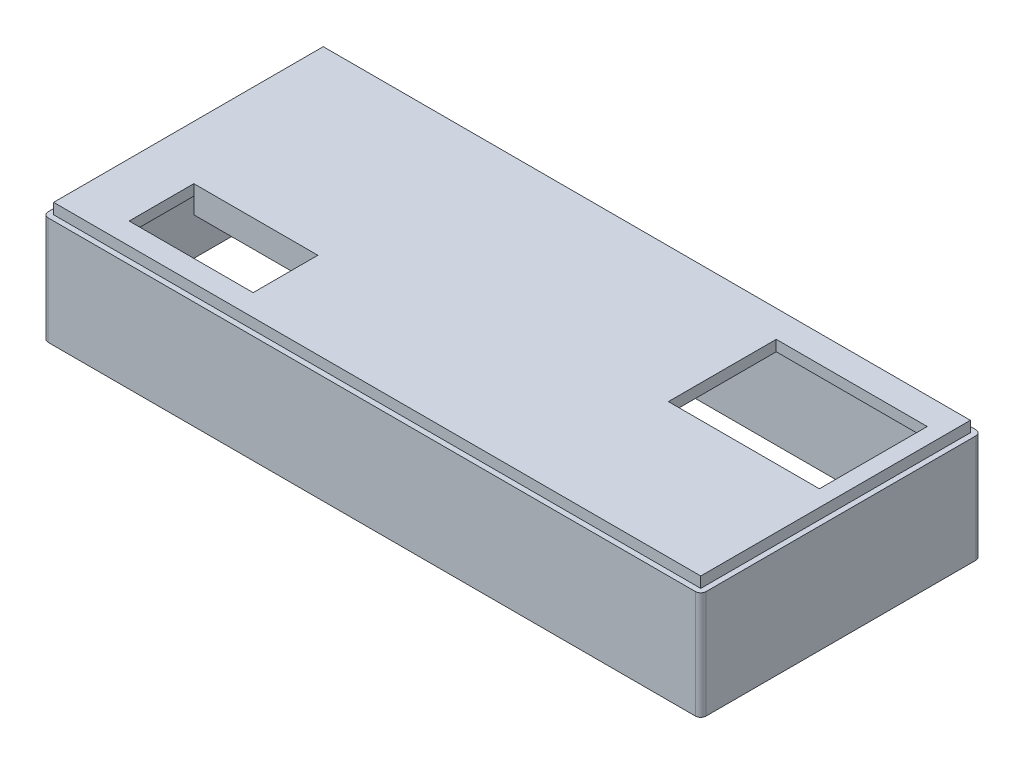
ISO-10303-21;
HEADER;
FILE_DESCRIPTION(('STEP AP214'),'2;1');
FILE_NAME('part.step','',(''),(''),'','','');
FILE_SCHEMA(('AUTOMOTIVE_DESIGN { 1 0 10303 214 1 1 1 1 }'));
ENDSEC;
DATA;
#1=APPLICATION_CONTEXT('core data for automotive mechanical design processes');
#2=APPLICATION_PROTOCOL_DEFINITION('international standard','automotive_design',2000,#1);
#3=PRODUCT_CONTEXT('',#1,'mechanical');
#4=PRODUCT('Part','Part','',(#3));
#5=PRODUCT_RELATED_PRODUCT_CATEGORY('part','',(#4));
#6=PRODUCT_DEFINITION_FORMATION('','',#4);
#7=PRODUCT_DEFINITION_CONTEXT('part definition',#1,'design');
#8=PRODUCT_DEFINITION('design','',#6,#7);
#9=PRODUCT_DEFINITION_SHAPE('','',#8);
#10=(LENGTH_UNIT() NAMED_UNIT(*) SI_UNIT(.MILLI.,.METRE.));
#11=(NAMED_UNIT(*) PLANE_ANGLE_UNIT() SI_UNIT($,.RADIAN.));
#12=(NAMED_UNIT(*) SI_UNIT($,.STERADIAN.) SOLID_ANGLE_UNIT());
#13=UNCERTAINTY_MEASURE_WITH_UNIT(LENGTH_MEASURE(1.E-05),#10,'distance_accuracy_value','');
#14=(GEOMETRIC_REPRESENTATION_CONTEXT(3) GLOBAL_UNCERTAINTY_ASSIGNED_CONTEXT((#13)) GLOBAL_UNIT_ASSIGNED_CONTEXT((#10,
#11,#12)) REPRESENTATION_CONTEXT('',''));
#15=CARTESIAN_POINT('',(0.,0.,0.));
#16=DIRECTION('',(0.,0.,1.));
#17=DIRECTION('',(1.,0.,0.));
#18=AXIS2_PLACEMENT_3D('',#15,#16,#17);
#19=CARTESIAN_POINT('',(0.,-20.,0.));
#20=DIRECTION('',(0.,-1.,0.));
#21=DIRECTION('',(0.,0.,-1.));
#22=AXIS2_PLACEMENT_3D('',#19,#20,#21);
#23=PLANE('',#22);
#24=DIRECTION('',(0.,0.,1.));
#25=VECTOR('',#24,1.);
#26=CARTESIAN_POINT('',(121.,-20.,0.));
#27=LINE('',#26,#25);
#28=CARTESIAN_POINT('',(121.,-20.,0.));
#29=VERTEX_POINT('',#28);
#30=CARTESIAN_POINT('',(121.,-20.,50.));
#31=VERTEX_POINT('',#30);
#32=EDGE_CURVE('E299',#29,#31,#27,.T.);
#33=ORIENTED_EDGE('',*,*,#32,.T.);
#34=CARTESIAN_POINT('',(120.,-20.,50.));
#35=DIRECTION('',(0.,-1.,0.));
#36=DIRECTION('',(0.,0.,-1.));
#37=AXIS2_PLACEMENT_3D('',#34,#35,#36);
#38=CIRCLE('',#37,1.);
#39=CARTESIAN_POINT('',(120.,-20.,51.));
#40=VERTEX_POINT('',#39);
#41=EDGE_CURVE('E243',#31,#40,#38,.T.);
#42=ORIENTED_EDGE('',*,*,#41,.T.);
#43=DIRECTION('',(-1.,0.,0.));
#44=VECTOR('',#43,1.);
#45=CARTESIAN_POINT('',(120.,-20.,51.));
#46=LINE('',#45,#44);
#47=CARTESIAN_POINT('',(0.,-20.,51.));
#48=VERTEX_POINT('',#47);
#49=EDGE_CURVE('E302',#40,#48,#46,.T.);
#50=ORIENTED_EDGE('',*,*,#49,.T.);
#51=CARTESIAN_POINT('',(0.,-20.,50.));
#52=DIRECTION('',(0.,-1.,0.));
#53=DIRECTION('',(0.,0.,-1.));
#54=AXIS2_PLACEMENT_3D('',#51,#52,#53);
#55=CIRCLE('',#54,1.);
#56=CARTESIAN_POINT('',(-0.999999999999994,-20.,50.));
#57=VERTEX_POINT('',#56);
#58=EDGE_CURVE('E241',#48,#57,#55,.T.);
#59=ORIENTED_EDGE('',*,*,#58,.T.);
#60=DIRECTION('',(0.,0.,-1.));
#61=VECTOR('',#60,1.);
#62=CARTESIAN_POINT('',(-0.999999999999994,-20.,50.));
#63=LINE('',#62,#61);
#64=CARTESIAN_POINT('',(-1.,-20.,0.));
#65=VERTEX_POINT('',#64);
#66=EDGE_CURVE('E209',#57,#65,#63,.T.);
#67=ORIENTED_EDGE('',*,*,#66,.T.);
#68=CARTESIAN_POINT('',(0.,-20.,0.));
#69=DIRECTION('',(0.,-1.,0.));
#70=DIRECTION('',(0.,0.,-1.));
#71=AXIS2_PLACEMENT_3D('',#68,#69,#70);
#72=CIRCLE('',#71,1.);
#73=CARTESIAN_POINT('',(0.,-20.,-1.));
#74=VERTEX_POINT('',#73);
#75=EDGE_CURVE('E239',#65,#74,#72,.T.);
#76=ORIENTED_EDGE('',*,*,#75,.T.);
#77=DIRECTION('',(1.,0.,0.));
#78=VECTOR('',#77,1.);
#79=CARTESIAN_POINT('',(0.,-20.,-1.));
#80=LINE('',#79,#78);
#81=CARTESIAN_POINT('',(120.,-20.,-1.));
#82=VERTEX_POINT('',#81);
#83=EDGE_CURVE('E204',#74,#82,#80,.T.);
#84=ORIENTED_EDGE('',*,*,#83,.T.);
#85=CARTESIAN_POINT('',(120.,-20.,0.));
#86=DIRECTION('',(0.,-1.,0.));
#87=DIRECTION('',(0.,0.,-1.));
#88=AXIS2_PLACEMENT_3D('',#85,#86,#87);
#89=CIRCLE('',#88,1.);
#90=EDGE_CURVE('E237',#82,#29,#89,.T.);
#91=ORIENTED_EDGE('',*,*,#90,.T.);
#92=EDGE_LOOP('',(#33,#42,#50,#59,#67,#76,#84,#91));
#93=FACE_BOUND('',#92,.T.);
#94=DIRECTION('',(-1.,0.,0.));
#95=VECTOR('',#94,1.);
#96=CARTESIAN_POINT('',(120.,-20.,50.));
#97=LINE('',#96,#95);
#98=CARTESIAN_POINT('',(119.,-20.,50.));
#99=VERTEX_POINT('',#98);
#100=CARTESIAN_POINT('',(1.,-20.,50.));
#101=VERTEX_POINT('',#100);
#102=EDGE_CURVE('E288',#99,#101,#97,.T.);
#103=ORIENTED_EDGE('',*,*,#102,.F.);
#104=CARTESIAN_POINT('',(119.,-20.,49.));
#105=DIRECTION('',(0.,-1.,0.));
#106=DIRECTION('',(0.,0.,-1.));
#107=AXIS2_PLACEMENT_3D('',#104,#105,#106);
#108=CIRCLE('',#107,1.);
#109=CARTESIAN_POINT('',(120.,-20.,49.));
#110=VERTEX_POINT('',#109);
#111=EDGE_CURVE('E265',#99,#110,#108,.F.);
#112=ORIENTED_EDGE('',*,*,#111,.T.);
#113=DIRECTION('',(0.,0.,1.));
#114=VECTOR('',#113,1.);
#115=CARTESIAN_POINT('',(120.,-20.,0.));
#116=LINE('',#115,#114);
#117=CARTESIAN_POINT('',(120.,-20.,1.));
#118=VERTEX_POINT('',#117);
#119=EDGE_CURVE('E281',#118,#110,#116,.T.);
#120=ORIENTED_EDGE('',*,*,#119,.F.);
#121=CARTESIAN_POINT('',(119.,-20.,1.));
#122=DIRECTION('',(0.,-1.,0.));
#123=DIRECTION('',(0.,0.,-1.));
#124=AXIS2_PLACEMENT_3D('',#121,#122,#123);
#125=CIRCLE('',#124,1.);
#126=CARTESIAN_POINT('',(119.,-20.,0.));
#127=VERTEX_POINT('',#126);
#128=EDGE_CURVE('E13',#118,#127,#125,.F.);
#129=ORIENTED_EDGE('',*,*,#128,.T.);
#130=DIRECTION('',(1.,0.,0.));
#131=VECTOR('',#130,1.);
#132=CARTESIAN_POINT('',(0.,-20.,0.));
#133=LINE('',#132,#131);
#134=CARTESIAN_POINT('',(1.,-20.,0.));
#135=VERTEX_POINT('',#134);
#136=EDGE_CURVE('E287',#135,#127,#133,.T.);
#137=ORIENTED_EDGE('',*,*,#136,.F.);
#138=CARTESIAN_POINT('',(1.,-20.,1.));
#139=DIRECTION('',(0.,-1.,0.));
#140=DIRECTION('',(0.,0.,-1.));
#141=AXIS2_PLACEMENT_3D('',#138,#139,#140);
#142=CIRCLE('',#141,1.);
#143=CARTESIAN_POINT('',(0.,-20.,1.));
#144=VERTEX_POINT('',#143);
#145=EDGE_CURVE('E84',#135,#144,#142,.F.);
#146=ORIENTED_EDGE('',*,*,#145,.T.);
#147=DIRECTION('',(0.,0.,-1.));
#148=VECTOR('',#147,1.);
#149=CARTESIAN_POINT('',(0.,-20.,50.));
#150=LINE('',#149,#148);
#151=CARTESIAN_POINT('',(0.,-20.,49.));
#152=VERTEX_POINT('',#151);
#153=EDGE_CURVE('E285',#152,#144,#150,.T.);
#154=ORIENTED_EDGE('',*,*,#153,.F.);
#155=CARTESIAN_POINT('',(1.,-20.,49.));
#156=DIRECTION('',(0.,-1.,0.));
#157=DIRECTION('',(0.,0.,-1.));
#158=AXIS2_PLACEMENT_3D('',#155,#156,#157);
#159=CIRCLE('',#158,1.);
#160=EDGE_CURVE('E269',#152,#101,#159,.F.);
#161=ORIENTED_EDGE('',*,*,#160,.T.);
#162=EDGE_LOOP('',(#103,#112,#120,#129,#137,#146,#154,#161));
#163=FACE_BOUND('',#162,.T.);
#164=ADVANCED_FACE('F69',(#93,#163),#23,.T.);
#165=CARTESIAN_POINT('',(0.,0.,0.));
#166=DIRECTION('',(0.,-1.,0.));
#167=DIRECTION('',(0.,0.,-1.));
#168=AXIS2_PLACEMENT_3D('',#165,#166,#167);
#169=PLANE('',#168);
#170=DIRECTION('',(-1.,0.,0.));
#171=VECTOR('',#170,1.);
#172=CARTESIAN_POINT('',(120.,0.,51.));
#173=LINE('',#172,#171);
#174=CARTESIAN_POINT('',(120.,0.,51.));
#175=VERTEX_POINT('',#174);
#176=CARTESIAN_POINT('',(0.,0.,51.));
#177=VERTEX_POINT('',#176);
#178=EDGE_CURVE('E309',#175,#177,#173,.T.);
#179=ORIENTED_EDGE('',*,*,#178,.F.);
#180=CARTESIAN_POINT('',(120.,0.,50.));
#181=DIRECTION('',(0.,-1.,0.));
#182=DIRECTION('',(0.,0.,-1.));
#183=AXIS2_PLACEMENT_3D('',#180,#181,#182);
#184=CIRCLE('',#183,1.);
#185=CARTESIAN_POINT('',(121.,0.,50.));
#186=VERTEX_POINT('',#185);
#187=EDGE_CURVE('E230',#175,#186,#184,.F.);
#188=ORIENTED_EDGE('',*,*,#187,.T.);
#189=DIRECTION('',(0.,0.,1.));
#190=VECTOR('',#189,1.);
#191=CARTESIAN_POINT('',(121.,0.,0.));
#192=LINE('',#191,#190);
#193=CARTESIAN_POINT('',(121.,0.,0.));
#194=VERTEX_POINT('',#193);
#195=EDGE_CURVE('E290',#194,#186,#192,.T.);
#196=ORIENTED_EDGE('',*,*,#195,.F.);
#197=CARTESIAN_POINT('',(120.,0.,0.));
#198=DIRECTION('',(0.,-1.,0.));
#199=DIRECTION('',(0.,0.,-1.));
#200=AXIS2_PLACEMENT_3D('',#197,#198,#199);
#201=CIRCLE('',#200,1.);
#202=CARTESIAN_POINT('',(120.,0.,-1.));
#203=VERTEX_POINT('',#202);
#204=EDGE_CURVE('E224',#194,#203,#201,.F.);
#205=ORIENTED_EDGE('',*,*,#204,.T.);
#206=DIRECTION('',(1.,0.,0.));
#207=VECTOR('',#206,1.);
#208=CARTESIAN_POINT('',(0.,0.,-1.));
#209=LINE('',#208,#207);
#210=CARTESIAN_POINT('',(0.,0.,-1.));
#211=VERTEX_POINT('',#210);
#212=EDGE_CURVE('E212',#211,#203,#209,.T.);
#213=ORIENTED_EDGE('',*,*,#212,.F.);
#214=CARTESIAN_POINT('',(0.,0.,0.));
#215=DIRECTION('',(0.,-1.,0.));
#216=DIRECTION('',(0.,0.,-1.));
#217=AXIS2_PLACEMENT_3D('',#214,#215,#216);
#218=CIRCLE('',#217,1.);
#219=CARTESIAN_POINT('',(-1.,0.,0.));
#220=VERTEX_POINT('',#219);
#221=EDGE_CURVE('E226',#211,#220,#218,.F.);
#222=ORIENTED_EDGE('',*,*,#221,.T.);
#223=DIRECTION('',(0.,0.,-1.));
#224=VECTOR('',#223,1.);
#225=CARTESIAN_POINT('',(-0.999999999999994,0.,50.));
#226=LINE('',#225,#224);
#227=CARTESIAN_POINT('',(-0.999999999999994,0.,50.));
#228=VERTEX_POINT('',#227);
#229=EDGE_CURVE('E311',#228,#220,#226,.T.);
#230=ORIENTED_EDGE('',*,*,#229,.F.);
#231=CARTESIAN_POINT('',(0.,0.,50.));
#232=DIRECTION('',(0.,-1.,0.));
#233=DIRECTION('',(0.,0.,-1.));
#234=AXIS2_PLACEMENT_3D('',#231,#232,#233);
#235=CIRCLE('',#234,1.);
#236=EDGE_CURVE('E228',#228,#177,#235,.F.);
#237=ORIENTED_EDGE('',*,*,#236,.T.);
#238=EDGE_LOOP('',(#179,#188,#196,#205,#213,#222,#230,#237));
#239=FACE_BOUND('',#238,.T.);
#240=DIRECTION('',(1.,0.,0.));
#241=VECTOR('',#240,1.);
#242=CARTESIAN_POINT('',(0.,0.,0.));
#243=LINE('',#242,#241);
#244=CARTESIAN_POINT('',(1.,0.,0.));
#245=VERTEX_POINT('',#244);
#246=CARTESIAN_POINT('',(119.,0.,0.));
#247=VERTEX_POINT('',#246);
#248=EDGE_CURVE('E187',#245,#247,#243,.T.);
#249=ORIENTED_EDGE('',*,*,#248,.T.);
#250=CARTESIAN_POINT('',(119.,0.,1.));
#251=DIRECTION('',(0.,-1.,0.));
#252=DIRECTION('',(0.,0.,-1.));
#253=AXIS2_PLACEMENT_3D('',#250,#251,#252);
#254=CIRCLE('',#253,1.);
#255=CARTESIAN_POINT('',(120.,0.,1.));
#256=VERTEX_POINT('',#255);
#257=EDGE_CURVE('E77',#247,#256,#254,.T.);
#258=ORIENTED_EDGE('',*,*,#257,.T.);
#259=DIRECTION('',(0.,0.,1.));
#260=VECTOR('',#259,1.);
#261=CARTESIAN_POINT('',(120.,0.,0.));
#262=LINE('',#261,#260);
#263=CARTESIAN_POINT('',(120.,0.,49.));
#264=VERTEX_POINT('',#263);
#265=EDGE_CURVE('E185',#256,#264,#262,.T.);
#266=ORIENTED_EDGE('',*,*,#265,.T.);
#267=CARTESIAN_POINT('',(119.,0.,49.));
#268=DIRECTION('',(0.,-1.,0.));
#269=DIRECTION('',(0.,0.,-1.));
#270=AXIS2_PLACEMENT_3D('',#267,#268,#269);
#271=CIRCLE('',#270,1.);
#272=CARTESIAN_POINT('',(119.,0.,50.));
#273=VERTEX_POINT('',#272);
#274=EDGE_CURVE('E263',#264,#273,#271,.T.);
#275=ORIENTED_EDGE('',*,*,#274,.T.);
#276=DIRECTION('',(-1.,0.,0.));
#277=VECTOR('',#276,1.);
#278=CARTESIAN_POINT('',(120.,0.,50.));
#279=LINE('',#278,#277);
#280=CARTESIAN_POINT('',(1.,0.,50.));
#281=VERTEX_POINT('',#280);
#282=EDGE_CURVE('E200',#273,#281,#279,.T.);
#283=ORIENTED_EDGE('',*,*,#282,.T.);
#284=CARTESIAN_POINT('',(1.,0.,49.));
#285=DIRECTION('',(0.,-1.,0.));
#286=DIRECTION('',(0.,0.,-1.));
#287=AXIS2_PLACEMENT_3D('',#284,#285,#286);
#288=CIRCLE('',#287,1.);
#289=CARTESIAN_POINT('',(0.,0.,49.));
#290=VERTEX_POINT('',#289);
#291=EDGE_CURVE('E267',#281,#290,#288,.T.);
#292=ORIENTED_EDGE('',*,*,#291,.T.);
#293=DIRECTION('',(0.,0.,-1.));
#294=VECTOR('',#293,1.);
#295=CARTESIAN_POINT('',(0.,0.,50.));
#296=LINE('',#295,#294);
#297=CARTESIAN_POINT('',(0.,0.,1.));
#298=VERTEX_POINT('',#297);
#299=EDGE_CURVE('E274',#290,#298,#296,.T.);
#300=ORIENTED_EDGE('',*,*,#299,.T.);
#301=CARTESIAN_POINT('',(1.,0.,1.));
#302=DIRECTION('',(0.,-1.,0.));
#303=DIRECTION('',(0.,0.,-1.));
#304=AXIS2_PLACEMENT_3D('',#301,#302,#303);
#305=CIRCLE('',#304,1.);
#306=EDGE_CURVE('E271',#298,#245,#305,.T.);
#307=ORIENTED_EDGE('',*,*,#306,.T.);
#308=EDGE_LOOP('',(#249,#258,#266,#275,#283,#292,#300,#307));
#309=FACE_BOUND('',#308,.T.);
#310=ADVANCED_FACE('F184',(#239,#309),#169,.F.);
#311=CARTESIAN_POINT('',(121.,-20.,0.));
#312=DIRECTION('',(-1.,0.,0.));
#313=DIRECTION('',(0.,0.,1.));
#314=AXIS2_PLACEMENT_3D('',#311,#312,#313);
#315=PLANE('',#314);
#316=ORIENTED_EDGE('',*,*,#195,.T.);
#317=DIRECTION('',(0.,1.,0.));
#318=VECTOR('',#317,1.);
#319=CARTESIAN_POINT('',(121.,-20.,50.));
#320=LINE('',#319,#318);
#321=EDGE_CURVE('E235',#186,#31,#320,.F.);
#322=ORIENTED_EDGE('',*,*,#321,.T.);
#323=ORIENTED_EDGE('',*,*,#32,.F.);
#324=DIRECTION('',(0.,1.,0.));
#325=VECTOR('',#324,1.);
#326=CARTESIAN_POINT('',(121.,-20.,0.));
#327=LINE('',#326,#325);
#328=EDGE_CURVE('E232',#29,#194,#327,.T.);
#329=ORIENTED_EDGE('',*,*,#328,.T.);
#330=EDGE_LOOP('',(#316,#322,#323,#329));
#331=FACE_BOUND('',#330,.T.);
#332=ADVANCED_FACE('F331',(#331),#315,.F.);
#333=CARTESIAN_POINT('',(120.,-20.,51.));
#334=DIRECTION('',(0.,0.,-1.));
#335=DIRECTION('',(-1.,0.,0.));
#336=AXIS2_PLACEMENT_3D('',#333,#334,#335);
#337=PLANE('',#336);
#338=ORIENTED_EDGE('',*,*,#49,.F.);
#339=DIRECTION('',(0.,1.,0.));
#340=VECTOR('',#339,1.);
#341=CARTESIAN_POINT('',(120.,-20.,51.));
#342=LINE('',#341,#340);
#343=EDGE_CURVE('E221',#40,#175,#342,.T.);
#344=ORIENTED_EDGE('',*,*,#343,.T.);
#345=ORIENTED_EDGE('',*,*,#178,.T.);
#346=DIRECTION('',(0.,1.,0.));
#347=VECTOR('',#346,1.);
#348=CARTESIAN_POINT('',(0.,-20.,51.));
#349=LINE('',#348,#347);
#350=EDGE_CURVE('E219',#177,#48,#349,.F.);
#351=ORIENTED_EDGE('',*,*,#350,.T.);
#352=EDGE_LOOP('',(#338,#344,#345,#351));
#353=FACE_BOUND('',#352,.T.);
#354=ADVANCED_FACE('F340',(#353),#337,.F.);
#355=CARTESIAN_POINT('',(-0.999999999999994,-20.,50.));
#356=DIRECTION('',(1.,0.,0.));
#357=DIRECTION('',(0.,0.,-1.));
#358=AXIS2_PLACEMENT_3D('',#355,#356,#357);
#359=PLANE('',#358);
#360=ORIENTED_EDGE('',*,*,#66,.F.);
#361=DIRECTION('',(0.,1.,0.));
#362=VECTOR('',#361,1.);
#363=CARTESIAN_POINT('',(-0.999999999999994,-20.,50.));
#364=LINE('',#363,#362);
#365=EDGE_CURVE('E247',#57,#228,#364,.T.);
#366=ORIENTED_EDGE('',*,*,#365,.T.);
#367=ORIENTED_EDGE('',*,*,#229,.T.);
#368=DIRECTION('',(0.,1.,0.));
#369=VECTOR('',#368,1.);
#370=CARTESIAN_POINT('',(-1.,-20.,0.));
#371=LINE('',#370,#369);
#372=EDGE_CURVE('E245',#220,#65,#371,.F.);
#373=ORIENTED_EDGE('',*,*,#372,.T.);
#374=EDGE_LOOP('',(#360,#366,#367,#373));
#375=FACE_BOUND('',#374,.T.);
#376=ADVANCED_FACE('F348',(#375),#359,.F.);
#377=CARTESIAN_POINT('',(0.,-20.,-1.));
#378=DIRECTION('',(0.,0.,1.));
#379=DIRECTION('',(1.,0.,0.));
#380=AXIS2_PLACEMENT_3D('',#377,#378,#379);
#381=PLANE('',#380);
#382=ORIENTED_EDGE('',*,*,#83,.F.);
#383=DIRECTION('',(0.,1.,0.));
#384=VECTOR('',#383,1.);
#385=CARTESIAN_POINT('',(0.,-20.,-1.));
#386=LINE('',#385,#384);
#387=EDGE_CURVE('E260',#74,#211,#386,.T.);
#388=ORIENTED_EDGE('',*,*,#387,.T.);
#389=ORIENTED_EDGE('',*,*,#212,.T.);
#390=DIRECTION('',(0.,1.,0.));
#391=VECTOR('',#390,1.);
#392=CARTESIAN_POINT('',(120.,-20.,-1.));
#393=LINE('',#392,#391);
#394=EDGE_CURVE('E258',#203,#82,#393,.F.);
#395=ORIENTED_EDGE('',*,*,#394,.T.);
#396=EDGE_LOOP('',(#382,#388,#389,#395));
#397=FACE_BOUND('',#396,.T.);
#398=ADVANCED_FACE('F321',(#397),#381,.F.);
#399=CARTESIAN_POINT('',(120.,-20.,0.));
#400=DIRECTION('',(-1.,0.,0.));
#401=DIRECTION('',(0.,0.,1.));
#402=AXIS2_PLACEMENT_3D('',#399,#400,#401);
#403=PLANE('',#402);
#404=ORIENTED_EDGE('',*,*,#119,.T.);
#405=DIRECTION('',(0.,1.,0.));
#406=VECTOR('',#405,1.);
#407=CARTESIAN_POINT('',(120.,0.,49.));
#408=LINE('',#407,#406);
#409=EDGE_CURVE('E199',#110,#264,#408,.T.);
#410=ORIENTED_EDGE('',*,*,#409,.T.);
#411=ORIENTED_EDGE('',*,*,#265,.F.);
#412=DIRECTION('',(0.,1.,0.));
#413=VECTOR('',#412,1.);
#414=CARTESIAN_POINT('',(120.,-20.,1.));
#415=LINE('',#414,#413);
#416=EDGE_CURVE('E196',#256,#118,#415,.F.);
#417=ORIENTED_EDGE('',*,*,#416,.T.);
#418=EDGE_LOOP('',(#404,#410,#411,#417));
#419=FACE_BOUND('',#418,.T.);
#420=ADVANCED_FACE('F195',(#419),#403,.T.);
#421=CARTESIAN_POINT('',(120.,-20.,50.));
#422=DIRECTION('',(0.,0.,-1.));
#423=DIRECTION('',(-1.,0.,0.));
#424=AXIS2_PLACEMENT_3D('',#421,#422,#423);
#425=PLANE('',#424);
#426=ORIENTED_EDGE('',*,*,#282,.F.);
#427=DIRECTION('',(0.,1.,0.));
#428=VECTOR('',#427,1.);
#429=CARTESIAN_POINT('',(119.,-20.,50.));
#430=LINE('',#429,#428);
#431=EDGE_CURVE('E217',#273,#99,#430,.F.);
#432=ORIENTED_EDGE('',*,*,#431,.T.);
#433=ORIENTED_EDGE('',*,*,#102,.T.);
#434=DIRECTION('',(0.,1.,0.));
#435=VECTOR('',#434,1.);
#436=CARTESIAN_POINT('',(1.,0.,50.));
#437=LINE('',#436,#435);
#438=EDGE_CURVE('E206',#101,#281,#437,.T.);
#439=ORIENTED_EDGE('',*,*,#438,.T.);
#440=EDGE_LOOP('',(#426,#432,#433,#439));
#441=FACE_BOUND('',#440,.T.);
#442=ADVANCED_FACE('F445',(#441),#425,.T.);
#443=CARTESIAN_POINT('',(0.,-20.,50.));
#444=DIRECTION('',(1.,0.,0.));
#445=DIRECTION('',(0.,0.,-1.));
#446=AXIS2_PLACEMENT_3D('',#443,#444,#445);
#447=PLANE('',#446);
#448=ORIENTED_EDGE('',*,*,#299,.F.);
#449=DIRECTION('',(0.,1.,0.));
#450=VECTOR('',#449,1.);
#451=CARTESIAN_POINT('',(0.,-20.,49.));
#452=LINE('',#451,#450);
#453=EDGE_CURVE('E91',#290,#152,#452,.F.);
#454=ORIENTED_EDGE('',*,*,#453,.T.);
#455=ORIENTED_EDGE('',*,*,#153,.T.);
#456=DIRECTION('',(0.,1.,0.));
#457=VECTOR('',#456,1.);
#458=CARTESIAN_POINT('',(0.,0.,1.));
#459=LINE('',#458,#457);
#460=EDGE_CURVE('E250',#144,#298,#459,.T.);
#461=ORIENTED_EDGE('',*,*,#460,.T.);
#462=EDGE_LOOP('',(#448,#454,#455,#461));
#463=FACE_BOUND('',#462,.T.);
#464=ADVANCED_FACE('F284',(#463),#447,.T.);
#465=CARTESIAN_POINT('',(0.,-20.,0.));
#466=DIRECTION('',(0.,0.,1.));
#467=DIRECTION('',(1.,0.,0.));
#468=AXIS2_PLACEMENT_3D('',#465,#466,#467);
#469=PLANE('',#468);
#470=ORIENTED_EDGE('',*,*,#248,.F.);
#471=DIRECTION('',(0.,1.,0.));
#472=VECTOR('',#471,1.);
#473=CARTESIAN_POINT('',(1.,-20.,0.));
#474=LINE('',#473,#472);
#475=EDGE_CURVE('E256',#245,#135,#474,.F.);
#476=ORIENTED_EDGE('',*,*,#475,.T.);
#477=ORIENTED_EDGE('',*,*,#136,.T.);
#478=DIRECTION('',(0.,1.,0.));
#479=VECTOR('',#478,1.);
#480=CARTESIAN_POINT('',(119.,0.,0.));
#481=LINE('',#480,#479);
#482=EDGE_CURVE('E254',#127,#247,#481,.T.);
#483=ORIENTED_EDGE('',*,*,#482,.T.);
#484=EDGE_LOOP('',(#470,#476,#477,#483));
#485=FACE_BOUND('',#484,.T.);
#486=ADVANCED_FACE('F279',(#485),#469,.T.);
#487=CARTESIAN_POINT('',(119.,-20.,49.));
#488=DIRECTION('',(0.,-1.,0.));
#489=DIRECTION('',(0.,0.,-1.));
#490=AXIS2_PLACEMENT_3D('',#487,#488,#489);
#491=CYLINDRICAL_SURFACE('',#490,1.);
#492=ORIENTED_EDGE('',*,*,#111,.F.);
#493=ORIENTED_EDGE('',*,*,#431,.F.);
#494=ORIENTED_EDGE('',*,*,#274,.F.);
#495=ORIENTED_EDGE('',*,*,#409,.F.);
#496=EDGE_LOOP('',(#492,#493,#494,#495));
#497=FACE_BOUND('',#496,.T.);
#498=ADVANCED_FACE('F367',(#497),#491,.F.);
#499=CARTESIAN_POINT('',(120.,-20.,50.));
#500=DIRECTION('',(0.,1.,0.));
#501=DIRECTION('',(0.,0.,1.));
#502=AXIS2_PLACEMENT_3D('',#499,#500,#501);
#503=CYLINDRICAL_SURFACE('',#502,1.);
#504=ORIENTED_EDGE('',*,*,#41,.F.);
#505=ORIENTED_EDGE('',*,*,#321,.F.);
#506=ORIENTED_EDGE('',*,*,#187,.F.);
#507=ORIENTED_EDGE('',*,*,#343,.F.);
#508=EDGE_LOOP('',(#504,#505,#506,#507));
#509=FACE_BOUND('',#508,.T.);
#510=ADVANCED_FACE('F335',(#509),#503,.T.);
#511=CARTESIAN_POINT('',(0.,-20.,50.));
#512=DIRECTION('',(0.,1.,0.));
#513=DIRECTION('',(0.,0.,1.));
#514=AXIS2_PLACEMENT_3D('',#511,#512,#513);
#515=CYLINDRICAL_SURFACE('',#514,1.);
#516=ORIENTED_EDGE('',*,*,#58,.F.);
#517=ORIENTED_EDGE('',*,*,#350,.F.);
#518=ORIENTED_EDGE('',*,*,#236,.F.);
#519=ORIENTED_EDGE('',*,*,#365,.F.);
#520=EDGE_LOOP('',(#516,#517,#518,#519));
#521=FACE_BOUND('',#520,.T.);
#522=ADVANCED_FACE('F344',(#521),#515,.T.);
#523=CARTESIAN_POINT('',(1.,-20.,49.));
#524=DIRECTION('',(0.,-1.,0.));
#525=DIRECTION('',(0.,0.,-1.));
#526=AXIS2_PLACEMENT_3D('',#523,#524,#525);
#527=CYLINDRICAL_SURFACE('',#526,1.);
#528=ORIENTED_EDGE('',*,*,#160,.F.);
#529=ORIENTED_EDGE('',*,*,#453,.F.);
#530=ORIENTED_EDGE('',*,*,#291,.F.);
#531=ORIENTED_EDGE('',*,*,#438,.F.);
#532=EDGE_LOOP('',(#528,#529,#530,#531));
#533=FACE_BOUND('',#532,.T.);
#534=ADVANCED_FACE('F375',(#533),#527,.F.);
#535=CARTESIAN_POINT('',(1.,-20.,1.));
#536=DIRECTION('',(0.,-1.,0.));
#537=DIRECTION('',(0.,0.,-1.));
#538=AXIS2_PLACEMENT_3D('',#535,#536,#537);
#539=CYLINDRICAL_SURFACE('',#538,1.);
#540=ORIENTED_EDGE('',*,*,#145,.F.);
#541=ORIENTED_EDGE('',*,*,#475,.F.);
#542=ORIENTED_EDGE('',*,*,#306,.F.);
#543=ORIENTED_EDGE('',*,*,#460,.F.);
#544=EDGE_LOOP('',(#540,#541,#542,#543));
#545=FACE_BOUND('',#544,.T.);
#546=ADVANCED_FACE('F283',(#545),#539,.F.);
#547=CARTESIAN_POINT('',(0.,-20.,0.));
#548=DIRECTION('',(0.,1.,0.));
#549=DIRECTION('',(0.,0.,1.));
#550=AXIS2_PLACEMENT_3D('',#547,#548,#549);
#551=CYLINDRICAL_SURFACE('',#550,1.);
#552=ORIENTED_EDGE('',*,*,#75,.F.);
#553=ORIENTED_EDGE('',*,*,#372,.F.);
#554=ORIENTED_EDGE('',*,*,#221,.F.);
#555=ORIENTED_EDGE('',*,*,#387,.F.);
#556=EDGE_LOOP('',(#552,#553,#554,#555));
#557=FACE_BOUND('',#556,.T.);
#558=ADVANCED_FACE('F350',(#557),#551,.T.);
#559=CARTESIAN_POINT('',(119.,-20.,1.));
#560=DIRECTION('',(0.,-1.,0.));
#561=DIRECTION('',(0.,0.,-1.));
#562=AXIS2_PLACEMENT_3D('',#559,#560,#561);
#563=CYLINDRICAL_SURFACE('',#562,1.);
#564=ORIENTED_EDGE('',*,*,#128,.F.);
#565=ORIENTED_EDGE('',*,*,#416,.F.);
#566=ORIENTED_EDGE('',*,*,#257,.F.);
#567=ORIENTED_EDGE('',*,*,#482,.F.);
#568=EDGE_LOOP('',(#564,#565,#566,#567));
#569=FACE_BOUND('',#568,.T.);
#570=ADVANCED_FACE('F203',(#569),#563,.F.);
#571=CARTESIAN_POINT('',(120.,-20.,0.));
#572=DIRECTION('',(0.,1.,0.));
#573=DIRECTION('',(0.,0.,1.));
#574=AXIS2_PLACEMENT_3D('',#571,#572,#573);
#575=CYLINDRICAL_SURFACE('',#574,1.);
#576=ORIENTED_EDGE('',*,*,#90,.F.);
#577=ORIENTED_EDGE('',*,*,#394,.F.);
#578=ORIENTED_EDGE('',*,*,#204,.F.);
#579=ORIENTED_EDGE('',*,*,#328,.F.);
#580=EDGE_LOOP('',(#576,#577,#578,#579));
#581=FACE_BOUND('',#580,.T.);
#582=ADVANCED_FACE('F71',(#581),#575,.T.);
#583=CLOSED_SHELL('',(#164,#310,#332,#354,#376,#398,#420,#442,#464,#486,#498,#510,#522,#534,
#546,#558,#570,#582));
#584=MANIFOLD_SOLID_BREP('B2',#583);
#585=CARTESIAN_POINT('',(0.,0.,0.));
#586=DIRECTION('',(0.,1.,0.));
#587=DIRECTION('',(0.,0.,1.));
#588=AXIS2_PLACEMENT_3D('',#585,#586,#587);
#589=PLANE('',#588);
#590=DIRECTION('',(0.,0.,1.));
#591=VECTOR('',#590,1.);
#592=CARTESIAN_POINT('',(0.,0.,0.));
#593=LINE('',#592,#591);
#594=CARTESIAN_POINT('',(0.,0.,0.));
#595=VERTEX_POINT('',#594);
#596=CARTESIAN_POINT('',(0.,0.,50.));
#597=VERTEX_POINT('',#596);
#598=EDGE_CURVE('E737',#595,#597,#593,.T.);
#599=ORIENTED_EDGE('',*,*,#598,.F.);
#600=DIRECTION('',(-1.,0.,0.));
#601=VECTOR('',#600,1.);
#602=CARTESIAN_POINT('',(0.,0.,0.));
#603=LINE('',#602,#601);
#604=CARTESIAN_POINT('',(120.,0.,0.));
#605=VERTEX_POINT('',#604);
#606=EDGE_CURVE('E742',#605,#595,#603,.T.);
#607=ORIENTED_EDGE('',*,*,#606,.F.);
#608=DIRECTION('',(0.,0.,-1.));
#609=VECTOR('',#608,1.);
#610=CARTESIAN_POINT('',(120.,0.,0.));
#611=LINE('',#610,#609);
#612=CARTESIAN_POINT('',(120.,0.,50.));
#613=VERTEX_POINT('',#612);
#614=EDGE_CURVE('E753',#613,#605,#611,.T.);
#615=ORIENTED_EDGE('',*,*,#614,.F.);
#616=DIRECTION('',(1.,0.,0.));
#617=VECTOR('',#616,1.);
#618=CARTESIAN_POINT('',(0.,0.,50.));
#619=LINE('',#618,#617);
#620=EDGE_CURVE('E751',#597,#613,#619,.T.);
#621=ORIENTED_EDGE('',*,*,#620,.F.);
#622=EDGE_LOOP('',(#599,#607,#615,#621));
#623=FACE_BOUND('',#622,.T.);
#624=DIRECTION('',(1.,0.,0.));
#625=VECTOR('',#624,1.);
#626=CARTESIAN_POINT('',(89.,0.,5.));
#627=LINE('',#626,#625);
#628=CARTESIAN_POINT('',(89.,0.,5.));
#629=VERTEX_POINT('',#628);
#630=CARTESIAN_POINT('',(117.,0.,5.));
#631=VERTEX_POINT('',#630);
#632=EDGE_CURVE('E708',#629,#631,#627,.T.);
#633=ORIENTED_EDGE('',*,*,#632,.F.);
#634=DIRECTION('',(0.,0.,-1.));
#635=VECTOR('',#634,1.);
#636=CARTESIAN_POINT('',(89.,0.,5.));
#637=LINE('',#636,#635);
#638=CARTESIAN_POINT('',(89.,0.,25.));
#639=VERTEX_POINT('',#638);
#640=EDGE_CURVE('E711',#639,#629,#637,.T.);
#641=ORIENTED_EDGE('',*,*,#640,.F.);
#642=DIRECTION('',(-1.,0.,0.));
#643=VECTOR('',#642,1.);
#644=CARTESIAN_POINT('',(89.,0.,25.));
#645=LINE('',#644,#643);
#646=CARTESIAN_POINT('',(117.,0.,25.));
#647=VERTEX_POINT('',#646);
#648=EDGE_CURVE('E728',#647,#639,#645,.T.);
#649=ORIENTED_EDGE('',*,*,#648,.F.);
#650=DIRECTION('',(0.,0.,1.));
#651=VECTOR('',#650,1.);
#652=CARTESIAN_POINT('',(117.,0.,5.));
#653=LINE('',#652,#651);
#654=EDGE_CURVE('E706',#631,#647,#653,.T.);
#655=ORIENTED_EDGE('',*,*,#654,.F.);
#656=EDGE_LOOP('',(#633,#641,#649,#655));
#657=FACE_BOUND('',#656,.T.);
#658=DIRECTION('',(0.,0.,-1.));
#659=VECTOR('',#658,1.);
#660=CARTESIAN_POINT('',(10.,0.,34.));
#661=LINE('',#660,#659);
#662=CARTESIAN_POINT('',(10.,0.,34.));
#663=VERTEX_POINT('',#662);
#664=CARTESIAN_POINT('',(10.,0.,33.));
#665=VERTEX_POINT('',#664);
#666=EDGE_CURVE('E635',#663,#665,#661,.T.);
#667=ORIENTED_EDGE('',*,*,#666,.F.);
#668=DIRECTION('',(0.,0.,-1.));
#669=VECTOR('',#668,1.);
#670=CARTESIAN_POINT('',(10.,0.,46.));
#671=LINE('',#670,#669);
#672=CARTESIAN_POINT('',(10.,0.,46.));
#673=VERTEX_POINT('',#672);
#674=EDGE_CURVE('E643',#673,#663,#671,.T.);
#675=ORIENTED_EDGE('',*,*,#674,.F.);
#676=DIRECTION('',(0.,0.,-1.));
#677=VECTOR('',#676,1.);
#678=CARTESIAN_POINT('',(10.,0.,47.));
#679=LINE('',#678,#677);
#680=CARTESIAN_POINT('',(10.,0.,47.));
#681=VERTEX_POINT('',#680);
#682=EDGE_CURVE('E661',#681,#673,#679,.T.);
#683=ORIENTED_EDGE('',*,*,#682,.F.);
#684=DIRECTION('',(-1.,0.,0.));
#685=VECTOR('',#684,1.);
#686=CARTESIAN_POINT('',(34.,0.,47.));
#687=LINE('',#686,#685);
#688=CARTESIAN_POINT('',(34.,0.,47.));
#689=VERTEX_POINT('',#688);
#690=EDGE_CURVE('E682',#689,#681,#687,.T.);
#691=ORIENTED_EDGE('',*,*,#690,.F.);
#692=DIRECTION('',(0.,0.,1.));
#693=VECTOR('',#692,1.);
#694=CARTESIAN_POINT('',(34.,0.,33.));
#695=LINE('',#694,#693);
#696=CARTESIAN_POINT('',(34.,0.,33.));
#697=VERTEX_POINT('',#696);
#698=EDGE_CURVE('E679',#697,#689,#695,.T.);
#699=ORIENTED_EDGE('',*,*,#698,.F.);
#700=DIRECTION('',(1.,0.,0.));
#701=VECTOR('',#700,1.);
#702=CARTESIAN_POINT('',(10.,0.,33.));
#703=LINE('',#702,#701);
#704=EDGE_CURVE('E530',#665,#697,#703,.T.);
#705=ORIENTED_EDGE('',*,*,#704,.F.);
#706=EDGE_LOOP('',(#667,#675,#683,#691,#699,#705));
#707=FACE_BOUND('',#706,.T.);
#708=ADVANCED_FACE('F507',(#623,#657,#707),#589,.F.);
#709=CARTESIAN_POINT('',(0.,2.,0.));
#710=DIRECTION('',(1.,0.,0.));
#711=DIRECTION('',(0.,0.,-1.));
#712=AXIS2_PLACEMENT_3D('',#709,#710,#711);
#713=PLANE('',#712);
#714=ORIENTED_EDGE('',*,*,#598,.T.);
#715=DIRECTION('',(0.,-1.,0.));
#716=VECTOR('',#715,1.);
#717=CARTESIAN_POINT('',(0.,2.,50.));
#718=LINE('',#717,#716);
#719=CARTESIAN_POINT('',(0.,2.,50.));
#720=VERTEX_POINT('',#719);
#721=EDGE_CURVE('E67',#720,#597,#718,.T.);
#722=ORIENTED_EDGE('',*,*,#721,.F.);
#723=DIRECTION('',(0.,0.,1.));
#724=VECTOR('',#723,1.);
#725=CARTESIAN_POINT('',(0.,2.,0.));
#726=LINE('',#725,#724);
#727=CARTESIAN_POINT('',(0.,2.,0.));
#728=VERTEX_POINT('',#727);
#729=EDGE_CURVE('E738',#728,#720,#726,.T.);
#730=ORIENTED_EDGE('',*,*,#729,.F.);
#731=DIRECTION('',(0.,-1.,0.));
#732=VECTOR('',#731,1.);
#733=CARTESIAN_POINT('',(0.,2.,0.));
#734=LINE('',#733,#732);
#735=EDGE_CURVE('E748',#728,#595,#734,.T.);
#736=ORIENTED_EDGE('',*,*,#735,.T.);
#737=EDGE_LOOP('',(#714,#722,#730,#736));
#738=FACE_BOUND('',#737,.T.);
#739=ADVANCED_FACE('F509',(#738),#713,.F.);
#740=CARTESIAN_POINT('',(0.,2.,50.));
#741=DIRECTION('',(0.,0.,-1.));
#742=DIRECTION('',(-1.,0.,0.));
#743=AXIS2_PLACEMENT_3D('',#740,#741,#742);
#744=PLANE('',#743);
#745=ORIENTED_EDGE('',*,*,#620,.T.);
#746=DIRECTION('',(0.,-1.,0.));
#747=VECTOR('',#746,1.);
#748=CARTESIAN_POINT('',(120.,2.,50.));
#749=LINE('',#748,#747);
#750=CARTESIAN_POINT('',(120.,2.,50.));
#751=VERTEX_POINT('',#750);
#752=EDGE_CURVE('E515',#751,#613,#749,.T.);
#753=ORIENTED_EDGE('',*,*,#752,.F.);
#754=DIRECTION('',(1.,0.,0.));
#755=VECTOR('',#754,1.);
#756=CARTESIAN_POINT('',(0.,2.,50.));
#757=LINE('',#756,#755);
#758=EDGE_CURVE('E741',#720,#751,#757,.T.);
#759=ORIENTED_EDGE('',*,*,#758,.F.);
#760=ORIENTED_EDGE('',*,*,#721,.T.);
#761=EDGE_LOOP('',(#745,#753,#759,#760));
#762=FACE_BOUND('',#761,.T.);
#763=ADVANCED_FACE('F780',(#762),#744,.F.);
#764=CARTESIAN_POINT('',(120.,2.,0.));
#765=DIRECTION('',(-1.,0.,0.));
#766=DIRECTION('',(0.,0.,1.));
#767=AXIS2_PLACEMENT_3D('',#764,#765,#766);
#768=PLANE('',#767);
#769=ORIENTED_EDGE('',*,*,#614,.T.);
#770=DIRECTION('',(0.,-1.,0.));
#771=VECTOR('',#770,1.);
#772=CARTESIAN_POINT('',(120.,2.,0.));
#773=LINE('',#772,#771);
#774=CARTESIAN_POINT('',(120.,2.,0.));
#775=VERTEX_POINT('',#774);
#776=EDGE_CURVE('E758',#775,#605,#773,.T.);
#777=ORIENTED_EDGE('',*,*,#776,.F.);
#778=DIRECTION('',(0.,0.,-1.));
#779=VECTOR('',#778,1.);
#780=CARTESIAN_POINT('',(120.,2.,0.));
#781=LINE('',#780,#779);
#782=EDGE_CURVE('E744',#751,#775,#781,.T.);
#783=ORIENTED_EDGE('',*,*,#782,.F.);
#784=ORIENTED_EDGE('',*,*,#752,.T.);
#785=EDGE_LOOP('',(#769,#777,#783,#784));
#786=FACE_BOUND('',#785,.T.);
#787=ADVANCED_FACE('F765',(#786),#768,.F.);
#788=CARTESIAN_POINT('',(0.,2.,0.));
#789=DIRECTION('',(0.,0.,1.));
#790=DIRECTION('',(1.,0.,0.));
#791=AXIS2_PLACEMENT_3D('',#788,#789,#790);
#792=PLANE('',#791);
#793=ORIENTED_EDGE('',*,*,#606,.T.);
#794=ORIENTED_EDGE('',*,*,#735,.F.);
#795=DIRECTION('',(-1.,0.,0.));
#796=VECTOR('',#795,1.);
#797=CARTESIAN_POINT('',(0.,2.,0.));
#798=LINE('',#797,#796);
#799=EDGE_CURVE('E746',#775,#728,#798,.T.);
#800=ORIENTED_EDGE('',*,*,#799,.F.);
#801=ORIENTED_EDGE('',*,*,#776,.T.);
#802=EDGE_LOOP('',(#793,#794,#800,#801));
#803=FACE_BOUND('',#802,.T.);
#804=ADVANCED_FACE('F774',(#803),#792,.F.);
#805=CARTESIAN_POINT('',(0.,2.,0.));
#806=DIRECTION('',(0.,1.,0.));
#807=DIRECTION('',(0.,0.,1.));
#808=AXIS2_PLACEMENT_3D('',#805,#806,#807);
#809=PLANE('',#808);
#810=DIRECTION('',(0.,0.,-1.));
#811=VECTOR('',#810,1.);
#812=CARTESIAN_POINT('',(10.,2.,46.));
#813=LINE('',#812,#811);
#814=CARTESIAN_POINT('',(10.,2.,46.));
#815=VERTEX_POINT('',#814);
#816=CARTESIAN_POINT('',(10.,2.,34.));
#817=VERTEX_POINT('',#816);
#818=EDGE_CURVE('E640',#815,#817,#813,.T.);
#819=ORIENTED_EDGE('',*,*,#818,.T.);
#820=DIRECTION('',(1.,0.,0.));
#821=VECTOR('',#820,1.);
#822=CARTESIAN_POINT('',(10.,2.,34.));
#823=LINE('',#822,#821);
#824=CARTESIAN_POINT('',(33.,2.,34.));
#825=VERTEX_POINT('',#824);
#826=EDGE_CURVE('E627',#817,#825,#823,.T.);
#827=ORIENTED_EDGE('',*,*,#826,.T.);
#828=DIRECTION('',(0.,0.,1.));
#829=VECTOR('',#828,1.);
#830=CARTESIAN_POINT('',(33.,2.,46.));
#831=LINE('',#830,#829);
#832=CARTESIAN_POINT('',(33.,2.,46.));
#833=VERTEX_POINT('',#832);
#834=EDGE_CURVE('E652',#825,#833,#831,.T.);
#835=ORIENTED_EDGE('',*,*,#834,.T.);
#836=DIRECTION('',(-1.,0.,0.));
#837=VECTOR('',#836,1.);
#838=CARTESIAN_POINT('',(10.,2.,46.));
#839=LINE('',#838,#837);
#840=EDGE_CURVE('E649',#833,#815,#839,.T.);
#841=ORIENTED_EDGE('',*,*,#840,.T.);
#842=EDGE_LOOP('',(#819,#827,#835,#841));
#843=FACE_BOUND('',#842,.T.);
#844=DIRECTION('',(0.,0.,1.));
#845=VECTOR('',#844,1.);
#846=CARTESIAN_POINT('',(89.,2.,5.));
#847=LINE('',#846,#845);
#848=CARTESIAN_POINT('',(89.,2.,5.));
#849=VERTEX_POINT('',#848);
#850=CARTESIAN_POINT('',(89.,2.,25.));
#851=VERTEX_POINT('',#850);
#852=EDGE_CURVE('E714',#849,#851,#847,.T.);
#853=ORIENTED_EDGE('',*,*,#852,.F.);
#854=DIRECTION('',(-1.,0.,0.));
#855=VECTOR('',#854,1.);
#856=CARTESIAN_POINT('',(89.,2.,5.));
#857=LINE('',#856,#855);
#858=CARTESIAN_POINT('',(117.,2.,5.));
#859=VERTEX_POINT('',#858);
#860=EDGE_CURVE('E722',#859,#849,#857,.T.);
#861=ORIENTED_EDGE('',*,*,#860,.F.);
#862=DIRECTION('',(0.,0.,-1.));
#863=VECTOR('',#862,1.);
#864=CARTESIAN_POINT('',(117.,2.,5.));
#865=LINE('',#864,#863);
#866=CARTESIAN_POINT('',(117.,2.,25.));
#867=VERTEX_POINT('',#866);
#868=EDGE_CURVE('E719',#867,#859,#865,.T.);
#869=ORIENTED_EDGE('',*,*,#868,.F.);
#870=DIRECTION('',(1.,0.,0.));
#871=VECTOR('',#870,1.);
#872=CARTESIAN_POINT('',(89.,2.,25.));
#873=LINE('',#872,#871);
#874=EDGE_CURVE('E716',#851,#867,#873,.T.);
#875=ORIENTED_EDGE('',*,*,#874,.F.);
#876=EDGE_LOOP('',(#853,#861,#869,#875));
#877=FACE_BOUND('',#876,.T.);
#878=ORIENTED_EDGE('',*,*,#729,.T.);
#879=ORIENTED_EDGE('',*,*,#758,.T.);
#880=ORIENTED_EDGE('',*,*,#782,.T.);
#881=ORIENTED_EDGE('',*,*,#799,.T.);
#882=EDGE_LOOP('',(#878,#879,#880,#881));
#883=FACE_BOUND('',#882,.T.);
#884=ADVANCED_FACE('F646',(#843,#877,#883),#809,.T.);
#885=CARTESIAN_POINT('',(89.,-20.001,5.));
#886=DIRECTION('',(-1.,0.,0.));
#887=DIRECTION('',(0.,0.,1.));
#888=AXIS2_PLACEMENT_3D('',#885,#886,#887);
#889=PLANE('',#888);
#890=ORIENTED_EDGE('',*,*,#640,.T.);
#891=DIRECTION('',(0.,1.,0.));
#892=VECTOR('',#891,1.);
#893=CARTESIAN_POINT('',(89.,-20.001,5.));
#894=LINE('',#893,#892);
#895=EDGE_CURVE('E726',#629,#849,#894,.T.);
#896=ORIENTED_EDGE('',*,*,#895,.T.);
#897=ORIENTED_EDGE('',*,*,#852,.T.);
#898=DIRECTION('',(0.,1.,0.));
#899=VECTOR('',#898,1.);
#900=CARTESIAN_POINT('',(89.,-20.001,25.));
#901=LINE('',#900,#899);
#902=EDGE_CURVE('E725',#639,#851,#901,.T.);
#903=ORIENTED_EDGE('',*,*,#902,.F.);
#904=EDGE_LOOP('',(#890,#896,#897,#903));
#905=FACE_BOUND('',#904,.T.);
#906=ADVANCED_FACE('F798',(#905),#889,.F.);
#907=CARTESIAN_POINT('',(89.,-20.001,5.));
#908=DIRECTION('',(0.,0.,-1.));
#909=DIRECTION('',(-1.,0.,0.));
#910=AXIS2_PLACEMENT_3D('',#907,#908,#909);
#911=PLANE('',#910);
#912=ORIENTED_EDGE('',*,*,#632,.T.);
#913=DIRECTION('',(0.,1.,0.));
#914=VECTOR('',#913,1.);
#915=CARTESIAN_POINT('',(117.,-20.001,5.));
#916=LINE('',#915,#914);
#917=EDGE_CURVE('E729',#631,#859,#916,.T.);
#918=ORIENTED_EDGE('',*,*,#917,.T.);
#919=ORIENTED_EDGE('',*,*,#860,.T.);
#920=ORIENTED_EDGE('',*,*,#895,.F.);
#921=EDGE_LOOP('',(#912,#918,#919,#920));
#922=FACE_BOUND('',#921,.T.);
#923=ADVANCED_FACE('F802',(#922),#911,.F.);
#924=CARTESIAN_POINT('',(117.,-20.001,5.));
#925=DIRECTION('',(1.,0.,0.));
#926=DIRECTION('',(0.,0.,-1.));
#927=AXIS2_PLACEMENT_3D('',#924,#925,#926);
#928=PLANE('',#927);
#929=ORIENTED_EDGE('',*,*,#654,.T.);
#930=DIRECTION('',(0.,1.,0.));
#931=VECTOR('',#930,1.);
#932=CARTESIAN_POINT('',(117.,-20.001,25.));
#933=LINE('',#932,#931);
#934=EDGE_CURVE('E731',#647,#867,#933,.T.);
#935=ORIENTED_EDGE('',*,*,#934,.T.);
#936=ORIENTED_EDGE('',*,*,#868,.T.);
#937=ORIENTED_EDGE('',*,*,#917,.F.);
#938=EDGE_LOOP('',(#929,#935,#936,#937));
#939=FACE_BOUND('',#938,.T.);
#940=ADVANCED_FACE('F807',(#939),#928,.F.);
#941=CARTESIAN_POINT('',(89.,-20.001,25.));
#942=DIRECTION('',(0.,0.,1.));
#943=DIRECTION('',(1.,0.,0.));
#944=AXIS2_PLACEMENT_3D('',#941,#942,#943);
#945=PLANE('',#944);
#946=ORIENTED_EDGE('',*,*,#648,.T.);
#947=ORIENTED_EDGE('',*,*,#902,.T.);
#948=ORIENTED_EDGE('',*,*,#874,.T.);
#949=ORIENTED_EDGE('',*,*,#934,.F.);
#950=EDGE_LOOP('',(#946,#947,#948,#949));
#951=FACE_BOUND('',#950,.T.);
#952=ADVANCED_FACE('F811',(#951),#945,.F.);
#953=CARTESIAN_POINT('',(10.,-3.,34.));
#954=DIRECTION('',(1.,0.,0.));
#955=DIRECTION('',(0.,0.,-1.));
#956=AXIS2_PLACEMENT_3D('',#953,#954,#955);
#957=PLANE('',#956);
#958=ORIENTED_EDGE('',*,*,#666,.T.);
#959=DIRECTION('',(0.,1.,0.));
#960=VECTOR('',#959,1.);
#961=CARTESIAN_POINT('',(10.,-3.,33.));
#962=LINE('',#961,#960);
#963=CARTESIAN_POINT('',(10.,-3.,33.));
#964=VERTEX_POINT('',#963);
#965=EDGE_CURVE('E704',#964,#665,#962,.T.);
#966=ORIENTED_EDGE('',*,*,#965,.F.);
#967=DIRECTION('',(0.,0.,-1.));
#968=VECTOR('',#967,1.);
#969=CARTESIAN_POINT('',(10.,-3.,34.));
#970=LINE('',#969,#968);
#971=CARTESIAN_POINT('',(10.,-3.,34.));
#972=VERTEX_POINT('',#971);
#973=EDGE_CURVE('E657',#972,#964,#970,.T.);
#974=ORIENTED_EDGE('',*,*,#973,.F.);
#975=DIRECTION('',(0.,1.,0.));
#976=VECTOR('',#975,1.);
#977=CARTESIAN_POINT('',(10.,-3.,34.));
#978=LINE('',#977,#976);
#979=EDGE_CURVE('E675',#972,#663,#978,.T.);
#980=ORIENTED_EDGE('',*,*,#979,.T.);
#981=EDGE_LOOP('',(#958,#966,#974,#980));
#982=FACE_BOUND('',#981,.T.);
#983=ADVANCED_FACE('F814',(#982),#957,.F.);
#984=CARTESIAN_POINT('',(10.,-3.,33.));
#985=DIRECTION('',(0.,0.,1.));
#986=DIRECTION('',(1.,0.,0.));
#987=AXIS2_PLACEMENT_3D('',#984,#985,#986);
#988=PLANE('',#987);
#989=ORIENTED_EDGE('',*,*,#704,.T.);
#990=DIRECTION('',(0.,1.,0.));
#991=VECTOR('',#990,1.);
#992=CARTESIAN_POINT('',(34.,-3.,33.));
#993=LINE('',#992,#991);
#994=CARTESIAN_POINT('',(34.,-3.,33.));
#995=VERTEX_POINT('',#994);
#996=EDGE_CURVE('E701',#995,#697,#993,.T.);
#997=ORIENTED_EDGE('',*,*,#996,.F.);
#998=DIRECTION('',(1.,0.,0.));
#999=VECTOR('',#998,1.);
#1000=CARTESIAN_POINT('',(10.,-3.,33.));
#1001=LINE('',#1000,#999);
#1002=EDGE_CURVE('E660',#964,#995,#1001,.T.);
#1003=ORIENTED_EDGE('',*,*,#1002,.F.);
#1004=ORIENTED_EDGE('',*,*,#965,.T.);
#1005=EDGE_LOOP('',(#989,#997,#1003,#1004));
#1006=FACE_BOUND('',#1005,.T.);
#1007=ADVANCED_FACE('F821',(#1006),#988,.F.);
#1008=CARTESIAN_POINT('',(34.,-3.,33.));
#1009=DIRECTION('',(-1.,0.,0.));
#1010=DIRECTION('',(0.,0.,1.));
#1011=AXIS2_PLACEMENT_3D('',#1008,#1009,#1010);
#1012=PLANE('',#1011);
#1013=ORIENTED_EDGE('',*,*,#698,.T.);
#1014=DIRECTION('',(0.,1.,0.));
#1015=VECTOR('',#1014,1.);
#1016=CARTESIAN_POINT('',(34.,-3.,47.));
#1017=LINE('',#1016,#1015);
#1018=CARTESIAN_POINT('',(34.,-3.,47.));
#1019=VERTEX_POINT('',#1018);
#1020=EDGE_CURVE('E698',#1019,#689,#1017,.T.);
#1021=ORIENTED_EDGE('',*,*,#1020,.F.);
#1022=DIRECTION('',(0.,0.,1.));
#1023=VECTOR('',#1022,1.);
#1024=CARTESIAN_POINT('',(34.,-3.,33.));
#1025=LINE('',#1024,#1023);
#1026=EDGE_CURVE('E663',#995,#1019,#1025,.T.);
#1027=ORIENTED_EDGE('',*,*,#1026,.F.);
#1028=ORIENTED_EDGE('',*,*,#996,.T.);
#1029=EDGE_LOOP('',(#1013,#1021,#1027,#1028));
#1030=FACE_BOUND('',#1029,.T.);
#1031=ADVANCED_FACE('F825',(#1030),#1012,.F.);
#1032=CARTESIAN_POINT('',(34.,-3.,47.));
#1033=DIRECTION('',(0.,0.,-1.));
#1034=DIRECTION('',(-1.,0.,0.));
#1035=AXIS2_PLACEMENT_3D('',#1032,#1033,#1034);
#1036=PLANE('',#1035);
#1037=ORIENTED_EDGE('',*,*,#690,.T.);
#1038=DIRECTION('',(0.,1.,0.));
#1039=VECTOR('',#1038,1.);
#1040=CARTESIAN_POINT('',(10.,-3.,47.));
#1041=LINE('',#1040,#1039);
#1042=CARTESIAN_POINT('',(10.,-3.,47.));
#1043=VERTEX_POINT('',#1042);
#1044=EDGE_CURVE('E695',#1043,#681,#1041,.T.);
#1045=ORIENTED_EDGE('',*,*,#1044,.F.);
#1046=DIRECTION('',(-1.,0.,0.));
#1047=VECTOR('',#1046,1.);
#1048=CARTESIAN_POINT('',(34.,-3.,47.));
#1049=LINE('',#1048,#1047);
#1050=EDGE_CURVE('E665',#1019,#1043,#1049,.T.);
#1051=ORIENTED_EDGE('',*,*,#1050,.F.);
#1052=ORIENTED_EDGE('',*,*,#1020,.T.);
#1053=EDGE_LOOP('',(#1037,#1045,#1051,#1052));
#1054=FACE_BOUND('',#1053,.T.);
#1055=ADVANCED_FACE('F829',(#1054),#1036,.F.);
#1056=CARTESIAN_POINT('',(10.,-3.,47.));
#1057=DIRECTION('',(1.,0.,0.));
#1058=DIRECTION('',(0.,0.,-1.));
#1059=AXIS2_PLACEMENT_3D('',#1056,#1057,#1058);
#1060=PLANE('',#1059);
#1061=ORIENTED_EDGE('',*,*,#682,.T.);
#1062=DIRECTION('',(0.,1.,0.));
#1063=VECTOR('',#1062,1.);
#1064=CARTESIAN_POINT('',(10.,-3.,46.));
#1065=LINE('',#1064,#1063);
#1066=CARTESIAN_POINT('',(10.,-3.,46.));
#1067=VERTEX_POINT('',#1066);
#1068=EDGE_CURVE('E692',#1067,#673,#1065,.T.);
#1069=ORIENTED_EDGE('',*,*,#1068,.F.);
#1070=DIRECTION('',(0.,0.,-1.));
#1071=VECTOR('',#1070,1.);
#1072=CARTESIAN_POINT('',(10.,-3.,47.));
#1073=LINE('',#1072,#1071);
#1074=EDGE_CURVE('E667',#1043,#1067,#1073,.T.);
#1075=ORIENTED_EDGE('',*,*,#1074,.F.);
#1076=ORIENTED_EDGE('',*,*,#1044,.T.);
#1077=EDGE_LOOP('',(#1061,#1069,#1075,#1076));
#1078=FACE_BOUND('',#1077,.T.);
#1079=ADVANCED_FACE('F833',(#1078),#1060,.F.);
#1080=CARTESIAN_POINT('',(10.,-3.,46.));
#1081=DIRECTION('',(0.,0.,1.));
#1082=DIRECTION('',(1.,0.,0.));
#1083=AXIS2_PLACEMENT_3D('',#1080,#1081,#1082);
#1084=PLANE('',#1083);
#1085=ORIENTED_EDGE('',*,*,#1068,.T.);
#1086=DIRECTION('',(0.,-1.,0.));
#1087=VECTOR('',#1086,1.);
#1088=CARTESIAN_POINT('',(10.,2.001,46.));
#1089=LINE('',#1088,#1087);
#1090=EDGE_CURVE('E636',#815,#673,#1089,.T.);
#1091=ORIENTED_EDGE('',*,*,#1090,.F.);
#1092=ORIENTED_EDGE('',*,*,#840,.F.);
#1093=DIRECTION('',(0.,1.,0.));
#1094=VECTOR('',#1093,1.);
#1095=CARTESIAN_POINT('',(33.,-3.,46.));
#1096=LINE('',#1095,#1094);
#1097=CARTESIAN_POINT('',(33.,-3.,46.));
#1098=VERTEX_POINT('',#1097);
#1099=EDGE_CURVE('E690',#1098,#833,#1096,.T.);
#1100=ORIENTED_EDGE('',*,*,#1099,.F.);
#1101=DIRECTION('',(1.,0.,0.));
#1102=VECTOR('',#1101,1.);
#1103=CARTESIAN_POINT('',(10.,-3.,46.));
#1104=LINE('',#1103,#1102);
#1105=EDGE_CURVE('E669',#1067,#1098,#1104,.T.);
#1106=ORIENTED_EDGE('',*,*,#1105,.F.);
#1107=EDGE_LOOP('',(#1085,#1091,#1092,#1100,#1106));
#1108=FACE_BOUND('',#1107,.T.);
#1109=ADVANCED_FACE('F837',(#1108),#1084,.F.);
#1110=CARTESIAN_POINT('',(33.,-3.,46.));
#1111=DIRECTION('',(1.,0.,0.));
#1112=DIRECTION('',(0.,0.,-1.));
#1113=AXIS2_PLACEMENT_3D('',#1110,#1111,#1112);
#1114=PLANE('',#1113);
#1115=ORIENTED_EDGE('',*,*,#1099,.T.);
#1116=ORIENTED_EDGE('',*,*,#834,.F.);
#1117=DIRECTION('',(0.,1.,0.));
#1118=VECTOR('',#1117,1.);
#1119=CARTESIAN_POINT('',(33.,-3.,34.));
#1120=LINE('',#1119,#1118);
#1121=CARTESIAN_POINT('',(33.,-3.,34.));
#1122=VERTEX_POINT('',#1121);
#1123=EDGE_CURVE('E522',#1122,#825,#1120,.T.);
#1124=ORIENTED_EDGE('',*,*,#1123,.F.);
#1125=DIRECTION('',(0.,0.,-1.));
#1126=VECTOR('',#1125,1.);
#1127=CARTESIAN_POINT('',(33.,-3.,46.));
#1128=LINE('',#1127,#1126);
#1129=EDGE_CURVE('E671',#1098,#1122,#1128,.T.);
#1130=ORIENTED_EDGE('',*,*,#1129,.F.);
#1131=EDGE_LOOP('',(#1115,#1116,#1124,#1130));
#1132=FACE_BOUND('',#1131,.T.);
#1133=ADVANCED_FACE('F841',(#1132),#1114,.F.);
#1134=CARTESIAN_POINT('',(33.,-3.,34.));
#1135=DIRECTION('',(0.,0.,-1.));
#1136=DIRECTION('',(-1.,0.,0.));
#1137=AXIS2_PLACEMENT_3D('',#1134,#1135,#1136);
#1138=PLANE('',#1137);
#1139=ORIENTED_EDGE('',*,*,#1123,.T.);
#1140=ORIENTED_EDGE('',*,*,#826,.F.);
#1141=DIRECTION('',(0.,-1.,0.));
#1142=VECTOR('',#1141,1.);
#1143=CARTESIAN_POINT('',(10.,2.001,34.));
#1144=LINE('',#1143,#1142);
#1145=EDGE_CURVE('E631',#817,#663,#1144,.T.);
#1146=ORIENTED_EDGE('',*,*,#1145,.T.);
#1147=ORIENTED_EDGE('',*,*,#979,.F.);
#1148=DIRECTION('',(-1.,0.,0.));
#1149=VECTOR('',#1148,1.);
#1150=CARTESIAN_POINT('',(33.,-3.,34.));
#1151=LINE('',#1150,#1149);
#1152=EDGE_CURVE('E673',#1122,#972,#1151,.T.);
#1153=ORIENTED_EDGE('',*,*,#1152,.F.);
#1154=EDGE_LOOP('',(#1139,#1140,#1146,#1147,#1153));
#1155=FACE_BOUND('',#1154,.T.);
#1156=ADVANCED_FACE('F629',(#1155),#1138,.F.);
#1157=CARTESIAN_POINT('',(0.,-3.,0.));
#1158=DIRECTION('',(0.,-1.,0.));
#1159=DIRECTION('',(0.,0.,-1.));
#1160=AXIS2_PLACEMENT_3D('',#1157,#1158,#1159);
#1161=PLANE('',#1160);
#1162=ORIENTED_EDGE('',*,*,#973,.T.);
#1163=ORIENTED_EDGE('',*,*,#1002,.T.);
#1164=ORIENTED_EDGE('',*,*,#1026,.T.);
#1165=ORIENTED_EDGE('',*,*,#1050,.T.);
#1166=ORIENTED_EDGE('',*,*,#1074,.T.);
#1167=ORIENTED_EDGE('',*,*,#1105,.T.);
#1168=ORIENTED_EDGE('',*,*,#1129,.T.);
#1169=ORIENTED_EDGE('',*,*,#1152,.T.);
#1170=EDGE_LOOP('',(#1162,#1163,#1164,#1165,#1166,#1167,#1168,#1169));
#1171=FACE_BOUND('',#1170,.T.);
#1172=ADVANCED_FACE('F848',(#1171),#1161,.T.);
#1173=CARTESIAN_POINT('',(10.,2.001,46.));
#1174=DIRECTION('',(-1.,0.,0.));
#1175=DIRECTION('',(0.,0.,1.));
#1176=AXIS2_PLACEMENT_3D('',#1173,#1174,#1175);
#1177=PLANE('',#1176);
#1178=ORIENTED_EDGE('',*,*,#1090,.T.);
#1179=ORIENTED_EDGE('',*,*,#674,.T.);
#1180=ORIENTED_EDGE('',*,*,#1145,.F.);
#1181=ORIENTED_EDGE('',*,*,#818,.F.);
#1182=EDGE_LOOP('',(#1178,#1179,#1180,#1181));
#1183=FACE_BOUND('',#1182,.T.);
#1184=ADVANCED_FACE('F639',(#1183),#1177,.F.);
#1185=CLOSED_SHELL('',(#708,#739,#763,#787,#804,#884,#906,#923,#940,#952,#983,#1007,#1031,#1055,
#1079,#1109,#1133,#1156,#1172,#1184));
#1186=MANIFOLD_SOLID_BREP('B7',#1185);
#1187=ADVANCED_BREP_SHAPE_REPRESENTATION('',(#18,#584,#1186),#14);
#1188=SHAPE_DEFINITION_REPRESENTATION(#9,#1187);
ENDSEC;
END-ISO-10303-21;
